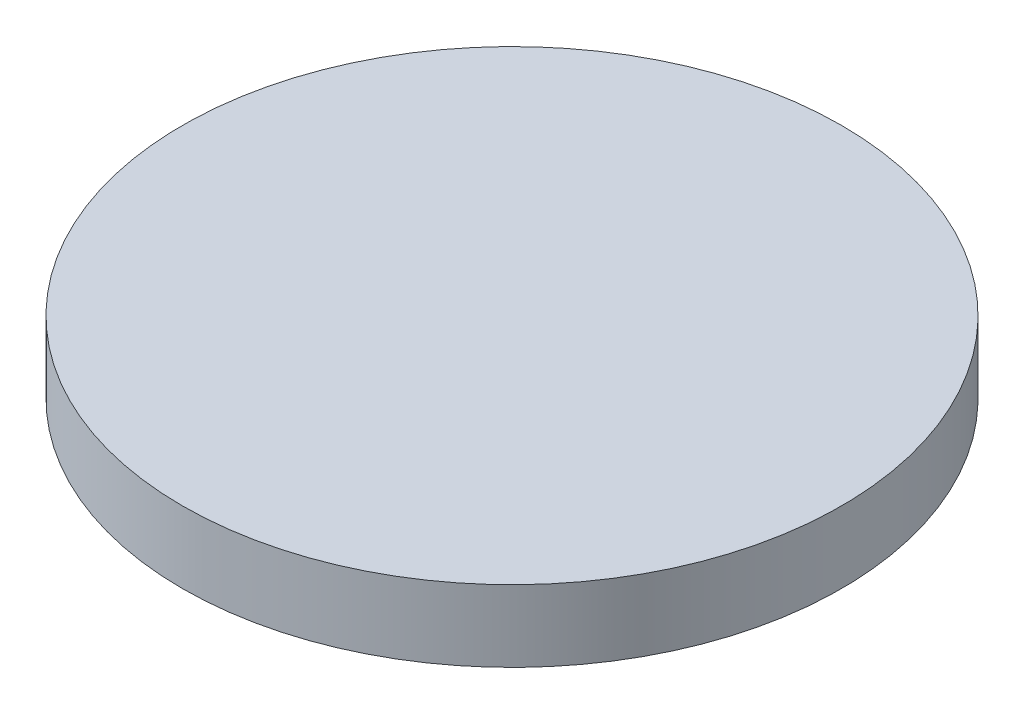
ISO-10303-21;
HEADER;
FILE_DESCRIPTION(('STEP AP214'),'2;1');
FILE_NAME('part.step','',(''),(''),'','','');
FILE_SCHEMA(('AUTOMOTIVE_DESIGN { 1 0 10303 214 1 1 1 1 }'));
ENDSEC;
DATA;
#1=APPLICATION_CONTEXT('core data for automotive mechanical design processes');
#2=APPLICATION_PROTOCOL_DEFINITION('international standard','automotive_design',2000,#1);
#3=PRODUCT_CONTEXT('',#1,'mechanical');
#4=PRODUCT('Part','Part','',(#3));
#5=PRODUCT_RELATED_PRODUCT_CATEGORY('part','',(#4));
#6=PRODUCT_DEFINITION_FORMATION('','',#4);
#7=PRODUCT_DEFINITION_CONTEXT('part definition',#1,'design');
#8=PRODUCT_DEFINITION('design','',#6,#7);
#9=PRODUCT_DEFINITION_SHAPE('','',#8);
#10=(LENGTH_UNIT() NAMED_UNIT(*) SI_UNIT(.MILLI.,.METRE.));
#11=(NAMED_UNIT(*) PLANE_ANGLE_UNIT() SI_UNIT($,.RADIAN.));
#12=(NAMED_UNIT(*) SI_UNIT($,.STERADIAN.) SOLID_ANGLE_UNIT());
#13=UNCERTAINTY_MEASURE_WITH_UNIT(LENGTH_MEASURE(1.E-05),#10,'distance_accuracy_value','');
#14=(GEOMETRIC_REPRESENTATION_CONTEXT(3) GLOBAL_UNCERTAINTY_ASSIGNED_CONTEXT((#13)) GLOBAL_UNIT_ASSIGNED_CONTEXT((#10,
#11,#12)) REPRESENTATION_CONTEXT('',''));
#15=CARTESIAN_POINT('',(0.,0.,0.));
#16=DIRECTION('',(0.,0.,1.));
#17=DIRECTION('',(1.,0.,0.));
#18=AXIS2_PLACEMENT_3D('',#15,#16,#17);
#19=CARTESIAN_POINT('',(0.,5.,0.));
#20=DIRECTION('',(0.,-1.,0.));
#21=DIRECTION('',(0.,0.,-1.));
#22=AXIS2_PLACEMENT_3D('',#19,#20,#21);
#23=CYLINDRICAL_SURFACE('',#22,23.);
#24=CARTESIAN_POINT('',(0.,5.,0.));
#25=DIRECTION('',(0.,1.,0.));
#26=DIRECTION('',(0.,0.,1.));
#27=AXIS2_PLACEMENT_3D('',#24,#25,#26);
#28=CIRCLE('',#27,23.);
#29=CARTESIAN_POINT('',(0.,5.,23.));
#30=VERTEX_POINT('',#29);
#31=EDGE_CURVE('E10',#30,#30,#28,.T.);
#32=ORIENTED_EDGE('',*,*,#31,.F.);
#33=EDGE_LOOP('',(#32));
#34=FACE_BOUND('',#33,.T.);
#35=CARTESIAN_POINT('',(0.,0.,0.));
#36=DIRECTION('',(0.,1.,0.));
#37=DIRECTION('',(0.,0.,1.));
#38=AXIS2_PLACEMENT_3D('',#35,#36,#37);
#39=CIRCLE('',#38,23.);
#40=CARTESIAN_POINT('',(0.,0.,23.));
#41=VERTEX_POINT('',#40);
#42=EDGE_CURVE('E34',#41,#41,#39,.T.);
#43=ORIENTED_EDGE('',*,*,#42,.T.);
#44=EDGE_LOOP('',(#43));
#45=FACE_BOUND('',#44,.T.);
#46=ADVANCED_FACE('F31',(#34,#45),#23,.T.);
#47=CARTESIAN_POINT('',(0.,5.,0.));
#48=DIRECTION('',(0.,1.,0.));
#49=DIRECTION('',(0.,0.,1.));
#50=AXIS2_PLACEMENT_3D('',#47,#48,#49);
#51=PLANE('',#50);
#52=ORIENTED_EDGE('',*,*,#31,.T.);
#53=EDGE_LOOP('',(#52));
#54=FACE_BOUND('',#53,.T.);
#55=ADVANCED_FACE('F46',(#54),#51,.T.);
#56=CARTESIAN_POINT('',(0.,0.,0.));
#57=DIRECTION('',(0.,1.,0.));
#58=DIRECTION('',(0.,0.,1.));
#59=AXIS2_PLACEMENT_3D('',#56,#57,#58);
#60=PLANE('',#59);
#61=ORIENTED_EDGE('',*,*,#42,.F.);
#62=EDGE_LOOP('',(#61));
#63=FACE_BOUND('',#62,.T.);
#64=ADVANCED_FACE('F44',(#63),#60,.F.);
#65=CLOSED_SHELL('',(#46,#55,#64));
#66=MANIFOLD_SOLID_BREP('B2',#65);
#67=ADVANCED_BREP_SHAPE_REPRESENTATION('',(#18,#66),#14);
#68=SHAPE_DEFINITION_REPRESENTATION(#9,#67);
ENDSEC;
END-ISO-10303-21;
